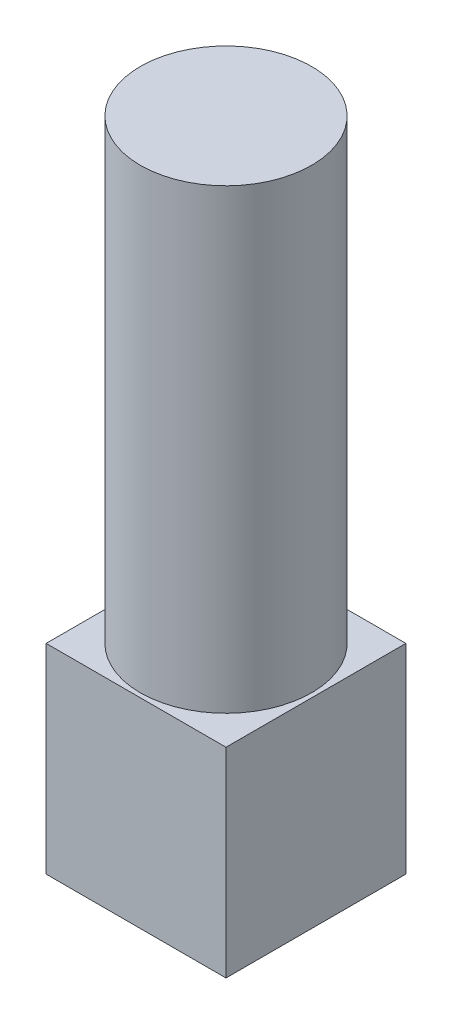
ISO-10303-21;
HEADER;
FILE_DESCRIPTION(('STEP AP214'),'2;1');
FILE_NAME('part.step','',(''),(''),'','','');
FILE_SCHEMA(('AUTOMOTIVE_DESIGN { 1 0 10303 214 1 1 1 1 }'));
ENDSEC;
DATA;
#1=APPLICATION_CONTEXT('core data for automotive mechanical design processes');
#2=APPLICATION_PROTOCOL_DEFINITION('international standard','automotive_design',2000,#1);
#3=PRODUCT_CONTEXT('',#1,'mechanical');
#4=PRODUCT('Part','Part','',(#3));
#5=PRODUCT_RELATED_PRODUCT_CATEGORY('part','',(#4));
#6=PRODUCT_DEFINITION_FORMATION('','',#4);
#7=PRODUCT_DEFINITION_CONTEXT('part definition',#1,'design');
#8=PRODUCT_DEFINITION('design','',#6,#7);
#9=PRODUCT_DEFINITION_SHAPE('','',#8);
#10=(LENGTH_UNIT() NAMED_UNIT(*) SI_UNIT(.MILLI.,.METRE.));
#11=(NAMED_UNIT(*) PLANE_ANGLE_UNIT() SI_UNIT($,.RADIAN.));
#12=(NAMED_UNIT(*) SI_UNIT($,.STERADIAN.) SOLID_ANGLE_UNIT());
#13=UNCERTAINTY_MEASURE_WITH_UNIT(LENGTH_MEASURE(1.E-05),#10,'distance_accuracy_value','');
#14=(GEOMETRIC_REPRESENTATION_CONTEXT(3) GLOBAL_UNCERTAINTY_ASSIGNED_CONTEXT((#13)) GLOBAL_UNIT_ASSIGNED_CONTEXT((#10,
#11,#12)) REPRESENTATION_CONTEXT('',''));
#15=CARTESIAN_POINT('',(0.,0.,0.));
#16=DIRECTION('',(0.,0.,1.));
#17=DIRECTION('',(1.,0.,0.));
#18=AXIS2_PLACEMENT_3D('',#15,#16,#17);
#19=CARTESIAN_POINT('',(-64.8177764954337,3.5,11.913286086967));
#20=DIRECTION('',(1.,0.,0.));
#21=DIRECTION('',(0.,0.,-1.));
#22=AXIS2_PLACEMENT_3D('',#19,#20,#21);
#23=PLANE('',#22);
#24=DIRECTION('',(0.,0.,1.));
#25=VECTOR('',#24,1.);
#26=CARTESIAN_POINT('',(-64.8177764954337,0.,11.913286086967));
#27=LINE('',#26,#25);
#28=CARTESIAN_POINT('',(-64.8177764954337,0.,11.913286086967));
#29=VERTEX_POINT('',#28);
#30=CARTESIAN_POINT('',(-64.8177764954337,0.,15.063286086967));
#31=VERTEX_POINT('',#30);
#32=EDGE_CURVE('E116',#29,#31,#27,.T.);
#33=ORIENTED_EDGE('',*,*,#32,.T.);
#34=DIRECTION('',(0.,-1.,0.));
#35=VECTOR('',#34,1.);
#36=CARTESIAN_POINT('',(-64.8177764954337,3.5,15.063286086967));
#37=LINE('',#36,#35);
#38=CARTESIAN_POINT('',(-64.8177764954337,3.5,15.063286086967));
#39=VERTEX_POINT('',#38);
#40=EDGE_CURVE('E48',#39,#31,#37,.T.);
#41=ORIENTED_EDGE('',*,*,#40,.F.);
#42=DIRECTION('',(0.,0.,1.));
#43=VECTOR('',#42,1.);
#44=CARTESIAN_POINT('',(-64.8177764954337,3.5,11.913286086967));
#45=LINE('',#44,#43);
#46=CARTESIAN_POINT('',(-64.8177764954337,3.5,11.913286086967));
#47=VERTEX_POINT('',#46);
#48=EDGE_CURVE('E99',#47,#39,#45,.T.);
#49=ORIENTED_EDGE('',*,*,#48,.F.);
#50=DIRECTION('',(0.,-1.,0.));
#51=VECTOR('',#50,1.);
#52=CARTESIAN_POINT('',(-64.8177764954337,3.5,11.913286086967));
#53=LINE('',#52,#51);
#54=EDGE_CURVE('E112',#47,#29,#53,.T.);
#55=ORIENTED_EDGE('',*,*,#54,.T.);
#56=EDGE_LOOP('',(#33,#41,#49,#55));
#57=FACE_BOUND('',#56,.T.);
#58=ADVANCED_FACE('F45',(#57),#23,.F.);
#59=CARTESIAN_POINT('',(-64.8177764954337,3.5,15.063286086967));
#60=DIRECTION('',(0.,0.,-1.));
#61=DIRECTION('',(-1.,0.,0.));
#62=AXIS2_PLACEMENT_3D('',#59,#60,#61);
#63=PLANE('',#62);
#64=DIRECTION('',(1.,0.,0.));
#65=VECTOR('',#64,1.);
#66=CARTESIAN_POINT('',(-64.8177764954337,0.,15.063286086967));
#67=LINE('',#66,#65);
#68=CARTESIAN_POINT('',(-61.6677764954337,0.,15.063286086967));
#69=VERTEX_POINT('',#68);
#70=EDGE_CURVE('E105',#31,#69,#67,.T.);
#71=ORIENTED_EDGE('',*,*,#70,.T.);
#72=DIRECTION('',(0.,-1.,0.));
#73=VECTOR('',#72,1.);
#74=CARTESIAN_POINT('',(-61.6677764954337,3.5,15.063286086967));
#75=LINE('',#74,#73);
#76=CARTESIAN_POINT('',(-61.6677764954337,3.5,15.063286086967));
#77=VERTEX_POINT('',#76);
#78=EDGE_CURVE('E103',#77,#69,#75,.T.);
#79=ORIENTED_EDGE('',*,*,#78,.F.);
#80=DIRECTION('',(1.,0.,0.));
#81=VECTOR('',#80,1.);
#82=CARTESIAN_POINT('',(-64.8177764954337,3.5,15.063286086967));
#83=LINE('',#82,#81);
#84=EDGE_CURVE('E94',#39,#77,#83,.T.);
#85=ORIENTED_EDGE('',*,*,#84,.F.);
#86=ORIENTED_EDGE('',*,*,#40,.T.);
#87=EDGE_LOOP('',(#71,#79,#85,#86));
#88=FACE_BOUND('',#87,.T.);
#89=ADVANCED_FACE('F104',(#88),#63,.F.);
#90=CARTESIAN_POINT('',(-61.6677764954337,3.5,11.913286086967));
#91=DIRECTION('',(-1.,0.,0.));
#92=DIRECTION('',(0.,0.,1.));
#93=AXIS2_PLACEMENT_3D('',#90,#91,#92);
#94=PLANE('',#93);
#95=DIRECTION('',(0.,0.,-1.));
#96=VECTOR('',#95,1.);
#97=CARTESIAN_POINT('',(-61.6677764954337,0.,11.913286086967));
#98=LINE('',#97,#96);
#99=CARTESIAN_POINT('',(-61.6677764954337,0.,11.913286086967));
#100=VERTEX_POINT('',#99);
#101=EDGE_CURVE('E80',#69,#100,#98,.T.);
#102=ORIENTED_EDGE('',*,*,#101,.T.);
#103=DIRECTION('',(0.,-1.,0.));
#104=VECTOR('',#103,1.);
#105=CARTESIAN_POINT('',(-61.6677764954337,3.5,11.913286086967));
#106=LINE('',#105,#104);
#107=CARTESIAN_POINT('',(-61.6677764954337,3.5,11.913286086967));
#108=VERTEX_POINT('',#107);
#109=EDGE_CURVE('E107',#108,#100,#106,.T.);
#110=ORIENTED_EDGE('',*,*,#109,.F.);
#111=DIRECTION('',(0.,0.,-1.));
#112=VECTOR('',#111,1.);
#113=CARTESIAN_POINT('',(-61.6677764954337,3.5,11.913286086967));
#114=LINE('',#113,#112);
#115=EDGE_CURVE('E97',#77,#108,#114,.T.);
#116=ORIENTED_EDGE('',*,*,#115,.F.);
#117=ORIENTED_EDGE('',*,*,#78,.T.);
#118=EDGE_LOOP('',(#102,#110,#116,#117));
#119=FACE_BOUND('',#118,.T.);
#120=ADVANCED_FACE('F108',(#119),#94,.F.);
#121=CARTESIAN_POINT('',(-64.8177764954337,3.5,11.913286086967));
#122=DIRECTION('',(0.,0.,1.));
#123=DIRECTION('',(1.,0.,0.));
#124=AXIS2_PLACEMENT_3D('',#121,#122,#123);
#125=PLANE('',#124);
#126=DIRECTION('',(-1.,0.,0.));
#127=VECTOR('',#126,1.);
#128=CARTESIAN_POINT('',(-64.8177764954337,0.,11.913286086967));
#129=LINE('',#128,#127);
#130=EDGE_CURVE('E86',#100,#29,#129,.T.);
#131=ORIENTED_EDGE('',*,*,#130,.T.);
#132=ORIENTED_EDGE('',*,*,#54,.F.);
#133=DIRECTION('',(-1.,0.,0.));
#134=VECTOR('',#133,1.);
#135=CARTESIAN_POINT('',(-64.8177764954337,3.5,11.913286086967));
#136=LINE('',#135,#134);
#137=EDGE_CURVE('E63',#108,#47,#136,.T.);
#138=ORIENTED_EDGE('',*,*,#137,.F.);
#139=ORIENTED_EDGE('',*,*,#109,.T.);
#140=EDGE_LOOP('',(#131,#132,#138,#139));
#141=FACE_BOUND('',#140,.T.);
#142=ADVANCED_FACE('F130',(#141),#125,.F.);
#143=CARTESIAN_POINT('',(0.,3.5,0.));
#144=DIRECTION('',(0.,1.,0.));
#145=DIRECTION('',(0.,0.,1.));
#146=AXIS2_PLACEMENT_3D('',#143,#144,#145);
#147=PLANE('',#146);
#148=CARTESIAN_POINT('',(-63.2427764954337,3.5,13.488286086967));
#149=DIRECTION('',(0.,1.,0.));
#150=DIRECTION('',(0.,0.,1.));
#151=AXIS2_PLACEMENT_3D('',#148,#149,#150);
#152=CIRCLE('',#151,1.5);
#153=CARTESIAN_POINT('',(-63.2427764954337,3.5,14.988286086967));
#154=VERTEX_POINT('',#153);
#155=EDGE_CURVE('E11',#154,#154,#152,.T.);
#156=ORIENTED_EDGE('',*,*,#155,.F.);
#157=EDGE_LOOP('',(#156));
#158=FACE_BOUND('',#157,.T.);
#159=ORIENTED_EDGE('',*,*,#48,.T.);
#160=ORIENTED_EDGE('',*,*,#84,.T.);
#161=ORIENTED_EDGE('',*,*,#115,.T.);
#162=ORIENTED_EDGE('',*,*,#137,.T.);
#163=EDGE_LOOP('',(#159,#160,#161,#162));
#164=FACE_BOUND('',#163,.T.);
#165=ADVANCED_FACE('F95',(#158,#164),#147,.T.);
#166=CARTESIAN_POINT('',(0.,0.,0.));
#167=DIRECTION('',(0.,1.,0.));
#168=DIRECTION('',(0.,0.,1.));
#169=AXIS2_PLACEMENT_3D('',#166,#167,#168);
#170=PLANE('',#169);
#171=ORIENTED_EDGE('',*,*,#32,.F.);
#172=ORIENTED_EDGE('',*,*,#130,.F.);
#173=ORIENTED_EDGE('',*,*,#101,.F.);
#174=ORIENTED_EDGE('',*,*,#70,.F.);
#175=EDGE_LOOP('',(#171,#172,#173,#174));
#176=FACE_BOUND('',#175,.T.);
#177=ADVANCED_FACE('F133',(#176),#170,.F.);
#178=CARTESIAN_POINT('',(-63.2427764954337,11.5,13.488286086967));
#179=DIRECTION('',(0.,-1.,0.));
#180=DIRECTION('',(0.,0.,-1.));
#181=AXIS2_PLACEMENT_3D('',#178,#179,#180);
#182=CYLINDRICAL_SURFACE('',#181,1.5);
#183=CARTESIAN_POINT('',(-63.2427764954337,11.5,13.488286086967));
#184=DIRECTION('',(0.,1.,0.));
#185=DIRECTION('',(0.,0.,1.));
#186=AXIS2_PLACEMENT_3D('',#183,#184,#185);
#187=CIRCLE('',#186,1.5);
#188=CARTESIAN_POINT('',(-63.2427764954337,11.5,14.988286086967));
#189=VERTEX_POINT('',#188);
#190=EDGE_CURVE('E120',#189,#189,#187,.T.);
#191=ORIENTED_EDGE('',*,*,#190,.F.);
#192=EDGE_LOOP('',(#191));
#193=FACE_BOUND('',#192,.T.);
#194=ORIENTED_EDGE('',*,*,#155,.T.);
#195=EDGE_LOOP('',(#194));
#196=FACE_BOUND('',#195,.T.);
#197=ADVANCED_FACE('F143',(#193,#196),#182,.T.);
#198=CARTESIAN_POINT('',(-63.2427764954337,11.5,13.488286086967));
#199=DIRECTION('',(0.,1.,0.));
#200=DIRECTION('',(0.,0.,1.));
#201=AXIS2_PLACEMENT_3D('',#198,#199,#200);
#202=PLANE('',#201);
#203=ORIENTED_EDGE('',*,*,#190,.T.);
#204=EDGE_LOOP('',(#203));
#205=FACE_BOUND('',#204,.T.);
#206=ADVANCED_FACE('F141',(#205),#202,.T.);
#207=CLOSED_SHELL('',(#58,#89,#120,#142,#165,#177,#197,#206));
#208=MANIFOLD_SOLID_BREP('B2',#207);
#209=ADVANCED_BREP_SHAPE_REPRESENTATION('',(#18,#208),#14);
#210=SHAPE_DEFINITION_REPRESENTATION(#9,#209);
ENDSEC;
END-ISO-10303-21;
